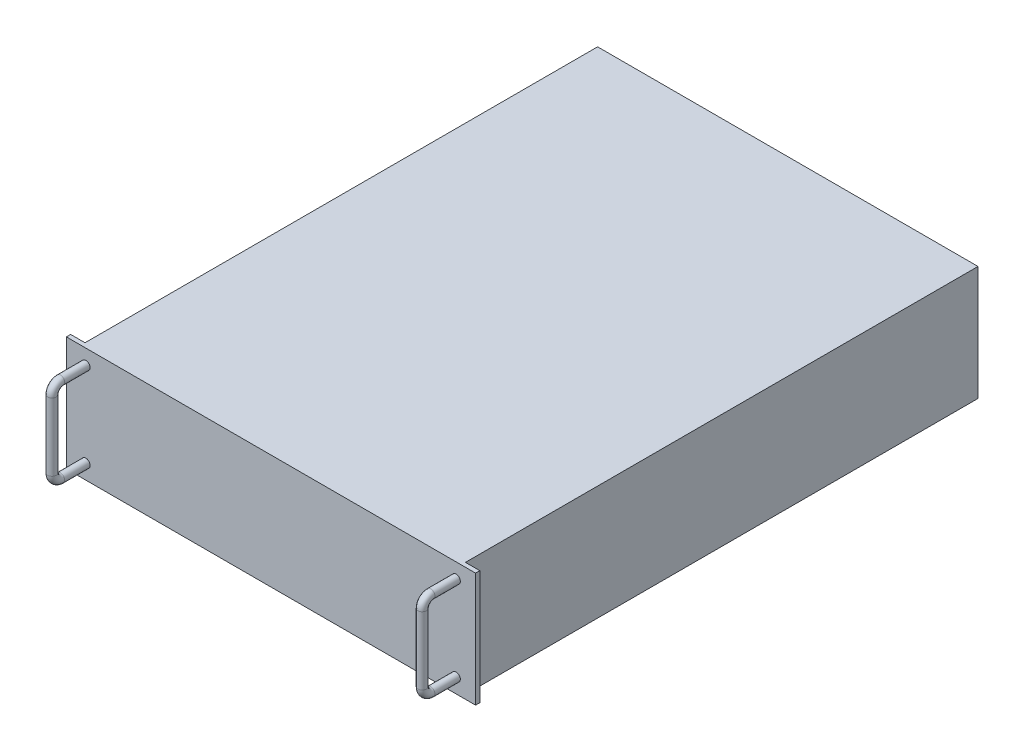
ISO-10303-21;
HEADER;
FILE_DESCRIPTION(('STEP AP214'),'2;1');
FILE_NAME('part.step','',(''),(''),'','','');
FILE_SCHEMA(('AUTOMOTIVE_DESIGN { 1 0 10303 214 1 1 1 1 }'));
ENDSEC;
DATA;
#1=APPLICATION_CONTEXT('core data for automotive mechanical design processes');
#2=APPLICATION_PROTOCOL_DEFINITION('international standard','automotive_design',2000,#1);
#3=PRODUCT_CONTEXT('',#1,'mechanical');
#4=PRODUCT('Part','Part','',(#3));
#5=PRODUCT_RELATED_PRODUCT_CATEGORY('part','',(#4));
#6=PRODUCT_DEFINITION_FORMATION('','',#4);
#7=PRODUCT_DEFINITION_CONTEXT('part definition',#1,'design');
#8=PRODUCT_DEFINITION('design','',#6,#7);
#9=PRODUCT_DEFINITION_SHAPE('','',#8);
#10=(LENGTH_UNIT() NAMED_UNIT(*) SI_UNIT(.MILLI.,.METRE.));
#11=(NAMED_UNIT(*) PLANE_ANGLE_UNIT() SI_UNIT($,.RADIAN.));
#12=(NAMED_UNIT(*) SI_UNIT($,.STERADIAN.) SOLID_ANGLE_UNIT());
#13=UNCERTAINTY_MEASURE_WITH_UNIT(LENGTH_MEASURE(1.E-05),#10,'distance_accuracy_value','');
#14=(GEOMETRIC_REPRESENTATION_CONTEXT(3) GLOBAL_UNCERTAINTY_ASSIGNED_CONTEXT((#13)) GLOBAL_UNIT_ASSIGNED_CONTEXT((#10,
#11,#12)) REPRESENTATION_CONTEXT('',''));
#15=CARTESIAN_POINT('',(0.,0.,0.));
#16=DIRECTION('',(0.,0.,1.));
#17=DIRECTION('',(1.,0.,0.));
#18=AXIS2_PLACEMENT_3D('',#15,#16,#17);
#19=CARTESIAN_POINT('',(0.,0.,0.));
#20=DIRECTION('',(0.,0.,-1.));
#21=DIRECTION('',(-1.,0.,0.));
#22=AXIS2_PLACEMENT_3D('',#19,#20,#21);
#23=PLANE('',#22);
#24=CARTESIAN_POINT('',(23.,117.5,0.));
#25=DIRECTION('',(0.,0.,-1.));
#26=DIRECTION('',(-1.,0.,0.));
#27=AXIS2_PLACEMENT_3D('',#24,#25,#26);
#28=CIRCLE('',#27,4.99999999999999);
#29=CARTESIAN_POINT('',(18.,117.5,0.));
#30=VERTEX_POINT('',#29);
#31=EDGE_CURVE('E196',#30,#30,#28,.F.);
#32=ORIENTED_EDGE('',*,*,#31,.F.);
#33=EDGE_LOOP('',(#32));
#34=FACE_BOUND('',#33,.T.);
#35=CARTESIAN_POINT('',(23.,17.5,0.));
#36=DIRECTION('',(0.,0.,1.));
#37=DIRECTION('',(-1.,0.,0.));
#38=AXIS2_PLACEMENT_3D('',#35,#36,#37);
#39=CIRCLE('',#38,4.99999999999999);
#40=CARTESIAN_POINT('',(18.,17.5,0.));
#41=VERTEX_POINT('',#40);
#42=EDGE_CURVE('E180',#41,#41,#39,.F.);
#43=ORIENTED_EDGE('',*,*,#42,.T.);
#44=EDGE_LOOP('',(#43));
#45=FACE_BOUND('',#44,.T.);
#46=CARTESIAN_POINT('',(460.,17.5,0.));
#47=DIRECTION('',(0.,0.,-1.));
#48=DIRECTION('',(1.,0.,0.));
#49=AXIS2_PLACEMENT_3D('',#46,#47,#48);
#50=CIRCLE('',#49,4.99999999999999);
#51=CARTESIAN_POINT('',(465.,17.5,0.));
#52=VERTEX_POINT('',#51);
#53=EDGE_CURVE('E152',#52,#52,#50,.T.);
#54=ORIENTED_EDGE('',*,*,#53,.T.);
#55=EDGE_LOOP('',(#54));
#56=FACE_BOUND('',#55,.T.);
#57=DIRECTION('',(0.,-1.,0.));
#58=VECTOR('',#57,1.);
#59=CARTESIAN_POINT('',(0.,0.,0.));
#60=LINE('',#59,#58);
#61=CARTESIAN_POINT('',(0.,135.,0.));
#62=VERTEX_POINT('',#61);
#63=CARTESIAN_POINT('',(0.,0.,0.));
#64=VERTEX_POINT('',#63);
#65=EDGE_CURVE('E137',#62,#64,#60,.T.);
#66=ORIENTED_EDGE('',*,*,#65,.T.);
#67=DIRECTION('',(1.,0.,0.));
#68=VECTOR('',#67,1.);
#69=CARTESIAN_POINT('',(0.,0.,0.));
#70=LINE('',#69,#68);
#71=CARTESIAN_POINT('',(483.,0.,0.));
#72=VERTEX_POINT('',#71);
#73=EDGE_CURVE('E135',#64,#72,#70,.T.);
#74=ORIENTED_EDGE('',*,*,#73,.T.);
#75=DIRECTION('',(0.,1.,0.));
#76=VECTOR('',#75,1.);
#77=CARTESIAN_POINT('',(483.,0.,0.));
#78=LINE('',#77,#76);
#79=CARTESIAN_POINT('',(483.,135.,0.));
#80=VERTEX_POINT('',#79);
#81=EDGE_CURVE('E123',#72,#80,#78,.T.);
#82=ORIENTED_EDGE('',*,*,#81,.T.);
#83=DIRECTION('',(-1.,0.,0.));
#84=VECTOR('',#83,1.);
#85=CARTESIAN_POINT('',(0.,135.,0.));
#86=LINE('',#85,#84);
#87=EDGE_CURVE('E130',#80,#62,#86,.T.);
#88=ORIENTED_EDGE('',*,*,#87,.T.);
#89=EDGE_LOOP('',(#66,#74,#82,#88));
#90=FACE_BOUND('',#89,.T.);
#91=CARTESIAN_POINT('',(460.,117.5,0.));
#92=DIRECTION('',(0.,0.,1.));
#93=DIRECTION('',(1.,0.,0.));
#94=AXIS2_PLACEMENT_3D('',#91,#92,#93);
#95=CIRCLE('',#94,4.99999999999999);
#96=CARTESIAN_POINT('',(465.,117.5,0.));
#97=VERTEX_POINT('',#96);
#98=EDGE_CURVE('E11',#97,#97,#95,.T.);
#99=ORIENTED_EDGE('',*,*,#98,.F.);
#100=EDGE_LOOP('',(#99));
#101=FACE_BOUND('',#100,.T.);
#102=ADVANCED_FACE('F34',(#34,#45,#56,#90,#101),#23,.F.);
#103=CARTESIAN_POINT('',(0.,0.,-610.));
#104=DIRECTION('',(-1.,0.,0.));
#105=DIRECTION('',(0.,0.,1.));
#106=AXIS2_PLACEMENT_3D('',#103,#104,#105);
#107=PLANE('',#106);
#108=DIRECTION('',(0.,0.,1.));
#109=VECTOR('',#108,1.);
#110=CARTESIAN_POINT('',(0.,135.,-610.));
#111=LINE('',#110,#109);
#112=CARTESIAN_POINT('',(0.,135.,-5.));
#113=VERTEX_POINT('',#112);
#114=EDGE_CURVE('E43',#113,#62,#111,.T.);
#115=ORIENTED_EDGE('',*,*,#114,.F.);
#116=DIRECTION('',(0.,1.,0.));
#117=VECTOR('',#116,1.);
#118=CARTESIAN_POINT('',(0.,0.,-5.));
#119=LINE('',#118,#117);
#120=CARTESIAN_POINT('',(0.,0.,-5.));
#121=VERTEX_POINT('',#120);
#122=EDGE_CURVE('E151',#121,#113,#119,.T.);
#123=ORIENTED_EDGE('',*,*,#122,.F.);
#124=DIRECTION('',(0.,0.,1.));
#125=VECTOR('',#124,1.);
#126=CARTESIAN_POINT('',(0.,0.,-610.));
#127=LINE('',#126,#125);
#128=EDGE_CURVE('E38',#121,#64,#127,.T.);
#129=ORIENTED_EDGE('',*,*,#128,.T.);
#130=ORIENTED_EDGE('',*,*,#65,.F.);
#131=EDGE_LOOP('',(#115,#123,#129,#130));
#132=FACE_BOUND('',#131,.T.);
#133=ADVANCED_FACE('F36',(#132),#107,.T.);
#134=CARTESIAN_POINT('',(483.,0.,-610.));
#135=DIRECTION('',(1.,0.,0.));
#136=DIRECTION('',(0.,0.,-1.));
#137=AXIS2_PLACEMENT_3D('',#134,#135,#136);
#138=PLANE('',#137);
#139=DIRECTION('',(0.,0.,1.));
#140=VECTOR('',#139,1.);
#141=CARTESIAN_POINT('',(483.,0.,-610.));
#142=LINE('',#141,#140);
#143=CARTESIAN_POINT('',(483.,0.,-5.));
#144=VERTEX_POINT('',#143);
#145=EDGE_CURVE('E116',#144,#72,#142,.T.);
#146=ORIENTED_EDGE('',*,*,#145,.F.);
#147=DIRECTION('',(0.,-1.,0.));
#148=VECTOR('',#147,1.);
#149=CARTESIAN_POINT('',(483.,135.,-5.));
#150=LINE('',#149,#148);
#151=CARTESIAN_POINT('',(483.,135.,-5.));
#152=VERTEX_POINT('',#151);
#153=EDGE_CURVE('E101',#152,#144,#150,.T.);
#154=ORIENTED_EDGE('',*,*,#153,.F.);
#155=DIRECTION('',(0.,0.,1.));
#156=VECTOR('',#155,1.);
#157=CARTESIAN_POINT('',(483.,135.,-610.));
#158=LINE('',#157,#156);
#159=EDGE_CURVE('E125',#152,#80,#158,.T.);
#160=ORIENTED_EDGE('',*,*,#159,.T.);
#161=ORIENTED_EDGE('',*,*,#81,.F.);
#162=EDGE_LOOP('',(#146,#154,#160,#161));
#163=FACE_BOUND('',#162,.T.);
#164=ADVANCED_FACE('F121',(#163),#138,.T.);
#165=CARTESIAN_POINT('',(0.,135.,-610.));
#166=DIRECTION('',(0.,1.,0.));
#167=DIRECTION('',(0.,0.,1.));
#168=AXIS2_PLACEMENT_3D('',#165,#166,#167);
#169=PLANE('',#168);
#170=DIRECTION('',(0.,0.,-1.));
#171=VECTOR('',#170,1.);
#172=CARTESIAN_POINT('',(466.,135.,-5.));
#173=LINE('',#172,#171);
#174=CARTESIAN_POINT('',(466.,135.,-5.));
#175=VERTEX_POINT('',#174);
#176=CARTESIAN_POINT('',(466.,135.,-610.));
#177=VERTEX_POINT('',#176);
#178=EDGE_CURVE('E140',#175,#177,#173,.T.);
#179=ORIENTED_EDGE('',*,*,#178,.T.);
#180=DIRECTION('',(-1.,0.,0.));
#181=VECTOR('',#180,1.);
#182=CARTESIAN_POINT('',(0.,135.,-610.));
#183=LINE('',#182,#181);
#184=CARTESIAN_POINT('',(17.,135.,-610.));
#185=VERTEX_POINT('',#184);
#186=EDGE_CURVE('E127',#177,#185,#183,.T.);
#187=ORIENTED_EDGE('',*,*,#186,.T.);
#188=DIRECTION('',(0.,0.,-1.));
#189=VECTOR('',#188,1.);
#190=CARTESIAN_POINT('',(17.,135.,-5.));
#191=LINE('',#190,#189);
#192=CARTESIAN_POINT('',(17.,135.,-5.));
#193=VERTEX_POINT('',#192);
#194=EDGE_CURVE('E59',#193,#185,#191,.T.);
#195=ORIENTED_EDGE('',*,*,#194,.F.);
#196=DIRECTION('',(1.,0.,0.));
#197=VECTOR('',#196,1.);
#198=CARTESIAN_POINT('',(0.,135.,-5.));
#199=LINE('',#198,#197);
#200=EDGE_CURVE('E157',#113,#193,#199,.T.);
#201=ORIENTED_EDGE('',*,*,#200,.F.);
#202=ORIENTED_EDGE('',*,*,#114,.T.);
#203=ORIENTED_EDGE('',*,*,#87,.F.);
#204=ORIENTED_EDGE('',*,*,#159,.F.);
#205=DIRECTION('',(1.,0.,0.));
#206=VECTOR('',#205,1.);
#207=CARTESIAN_POINT('',(483.,135.,-5.));
#208=LINE('',#207,#206);
#209=EDGE_CURVE('E107',#175,#152,#208,.T.);
#210=ORIENTED_EDGE('',*,*,#209,.F.);
#211=EDGE_LOOP('',(#179,#187,#195,#201,#202,#203,#204,#210));
#212=FACE_BOUND('',#211,.T.);
#213=ADVANCED_FACE('F280',(#212),#169,.T.);
#214=CARTESIAN_POINT('',(0.,0.,-610.));
#215=DIRECTION('',(0.,-1.,0.));
#216=DIRECTION('',(0.,0.,-1.));
#217=AXIS2_PLACEMENT_3D('',#214,#215,#216);
#218=PLANE('',#217);
#219=DIRECTION('',(0.,0.,-1.));
#220=VECTOR('',#219,1.);
#221=CARTESIAN_POINT('',(466.,0.,-5.));
#222=LINE('',#221,#220);
#223=CARTESIAN_POINT('',(466.,0.,-5.));
#224=VERTEX_POINT('',#223);
#225=CARTESIAN_POINT('',(466.,0.,-610.));
#226=VERTEX_POINT('',#225);
#227=EDGE_CURVE('E51',#224,#226,#222,.T.);
#228=ORIENTED_EDGE('',*,*,#227,.F.);
#229=DIRECTION('',(-1.,0.,0.));
#230=VECTOR('',#229,1.);
#231=CARTESIAN_POINT('',(483.,0.,-5.));
#232=LINE('',#231,#230);
#233=EDGE_CURVE('E105',#144,#224,#232,.T.);
#234=ORIENTED_EDGE('',*,*,#233,.F.);
#235=ORIENTED_EDGE('',*,*,#145,.T.);
#236=ORIENTED_EDGE('',*,*,#73,.F.);
#237=ORIENTED_EDGE('',*,*,#128,.F.);
#238=DIRECTION('',(-1.,0.,0.));
#239=VECTOR('',#238,1.);
#240=CARTESIAN_POINT('',(0.,0.,-5.));
#241=LINE('',#240,#239);
#242=CARTESIAN_POINT('',(17.,0.,-5.));
#243=VERTEX_POINT('',#242);
#244=EDGE_CURVE('E146',#243,#121,#241,.T.);
#245=ORIENTED_EDGE('',*,*,#244,.F.);
#246=DIRECTION('',(0.,0.,-1.));
#247=VECTOR('',#246,1.);
#248=CARTESIAN_POINT('',(17.,0.,-5.));
#249=LINE('',#248,#247);
#250=CARTESIAN_POINT('',(17.,0.,-610.));
#251=VERTEX_POINT('',#250);
#252=EDGE_CURVE('E145',#243,#251,#249,.T.);
#253=ORIENTED_EDGE('',*,*,#252,.T.);
#254=DIRECTION('',(1.,0.,0.));
#255=VECTOR('',#254,1.);
#256=CARTESIAN_POINT('',(0.,0.,-610.));
#257=LINE('',#256,#255);
#258=EDGE_CURVE('E133',#251,#226,#257,.T.);
#259=ORIENTED_EDGE('',*,*,#258,.T.);
#260=EDGE_LOOP('',(#228,#234,#235,#236,#237,#245,#253,#259));
#261=FACE_BOUND('',#260,.T.);
#262=ADVANCED_FACE('F114',(#261),#218,.T.);
#263=CARTESIAN_POINT('',(0.,0.,-610.));
#264=DIRECTION('',(0.,0.,-1.));
#265=DIRECTION('',(-1.,0.,0.));
#266=AXIS2_PLACEMENT_3D('',#263,#264,#265);
#267=PLANE('',#266);
#268=DIRECTION('',(0.,1.,0.));
#269=VECTOR('',#268,1.);
#270=CARTESIAN_POINT('',(466.,135.,-610.));
#271=LINE('',#270,#269);
#272=EDGE_CURVE('E111',#226,#177,#271,.T.);
#273=ORIENTED_EDGE('',*,*,#272,.F.);
#274=ORIENTED_EDGE('',*,*,#258,.F.);
#275=DIRECTION('',(0.,-1.,0.));
#276=VECTOR('',#275,1.);
#277=CARTESIAN_POINT('',(17.,0.,-610.));
#278=LINE('',#277,#276);
#279=EDGE_CURVE('E149',#185,#251,#278,.T.);
#280=ORIENTED_EDGE('',*,*,#279,.F.);
#281=ORIENTED_EDGE('',*,*,#186,.F.);
#282=EDGE_LOOP('',(#273,#274,#280,#281));
#283=FACE_BOUND('',#282,.T.);
#284=ADVANCED_FACE('F276',(#283),#267,.T.);
#285=CARTESIAN_POINT('',(17.,0.,-5.));
#286=DIRECTION('',(1.,0.,0.));
#287=DIRECTION('',(0.,0.,-1.));
#288=AXIS2_PLACEMENT_3D('',#285,#286,#287);
#289=PLANE('',#288);
#290=ORIENTED_EDGE('',*,*,#279,.T.);
#291=ORIENTED_EDGE('',*,*,#252,.F.);
#292=DIRECTION('',(0.,-1.,0.));
#293=VECTOR('',#292,1.);
#294=CARTESIAN_POINT('',(17.,0.,-5.));
#295=LINE('',#294,#293);
#296=EDGE_CURVE('E154',#193,#243,#295,.T.);
#297=ORIENTED_EDGE('',*,*,#296,.F.);
#298=ORIENTED_EDGE('',*,*,#194,.T.);
#299=EDGE_LOOP('',(#290,#291,#297,#298));
#300=FACE_BOUND('',#299,.T.);
#301=ADVANCED_FACE('F272',(#300),#289,.F.);
#302=CARTESIAN_POINT('',(0.,0.,-5.));
#303=DIRECTION('',(0.,0.,-1.));
#304=DIRECTION('',(-1.,0.,0.));
#305=AXIS2_PLACEMENT_3D('',#302,#303,#304);
#306=PLANE('',#305);
#307=ORIENTED_EDGE('',*,*,#122,.T.);
#308=ORIENTED_EDGE('',*,*,#200,.T.);
#309=ORIENTED_EDGE('',*,*,#296,.T.);
#310=ORIENTED_EDGE('',*,*,#244,.T.);
#311=EDGE_LOOP('',(#307,#308,#309,#310));
#312=FACE_BOUND('',#311,.T.);
#313=ADVANCED_FACE('F269',(#312),#306,.T.);
#314=CARTESIAN_POINT('',(466.,135.,-5.));
#315=DIRECTION('',(-1.,0.,0.));
#316=DIRECTION('',(0.,0.,1.));
#317=AXIS2_PLACEMENT_3D('',#314,#315,#316);
#318=PLANE('',#317);
#319=ORIENTED_EDGE('',*,*,#272,.T.);
#320=ORIENTED_EDGE('',*,*,#178,.F.);
#321=DIRECTION('',(0.,1.,0.));
#322=VECTOR('',#321,1.);
#323=CARTESIAN_POINT('',(466.,135.,-5.));
#324=LINE('',#323,#322);
#325=EDGE_CURVE('E119',#224,#175,#324,.T.);
#326=ORIENTED_EDGE('',*,*,#325,.F.);
#327=ORIENTED_EDGE('',*,*,#227,.T.);
#328=EDGE_LOOP('',(#319,#320,#326,#327));
#329=FACE_BOUND('',#328,.T.);
#330=ADVANCED_FACE('F226',(#329),#318,.F.);
#331=CARTESIAN_POINT('',(0.,0.,-5.));
#332=DIRECTION('',(0.,0.,-1.));
#333=DIRECTION('',(-1.,0.,0.));
#334=AXIS2_PLACEMENT_3D('',#331,#332,#333);
#335=PLANE('',#334);
#336=ORIENTED_EDGE('',*,*,#153,.T.);
#337=ORIENTED_EDGE('',*,*,#233,.T.);
#338=ORIENTED_EDGE('',*,*,#325,.T.);
#339=ORIENTED_EDGE('',*,*,#209,.T.);
#340=EDGE_LOOP('',(#336,#337,#338,#339));
#341=FACE_BOUND('',#340,.T.);
#342=ADVANCED_FACE('F103',(#341),#335,.T.);
#343=CARTESIAN_POINT('',(460.,117.5,0.));
#344=DIRECTION('',(0.,0.,1.));
#345=DIRECTION('',(0.,-1.,0.));
#346=AXIS2_PLACEMENT_3D('',#343,#344,#345);
#347=CYLINDRICAL_SURFACE('',#346,4.99999999999999);
#348=CARTESIAN_POINT('',(460.,117.5,29.9999999999999));
#349=DIRECTION('',(0.,0.,1.));
#350=DIRECTION('',(1.,0.,0.));
#351=AXIS2_PLACEMENT_3D('',#348,#349,#350);
#352=CIRCLE('',#351,4.99999999999999);
#353=CARTESIAN_POINT('',(460.,122.5,29.9999999999999));
#354=VERTEX_POINT('',#353);
#355=EDGE_CURVE('E178',#354,#354,#352,.T.);
#356=ORIENTED_EDGE('',*,*,#355,.F.);
#357=EDGE_LOOP('',(#356));
#358=FACE_BOUND('',#357,.T.);
#359=ORIENTED_EDGE('',*,*,#98,.T.);
#360=EDGE_LOOP('',(#359));
#361=FACE_BOUND('',#360,.T.);
#362=ADVANCED_FACE('F213',(#358,#361),#347,.T.);
#363=CARTESIAN_POINT('',(460.,107.5,30.));
#364=DIRECTION('',(1.,0.,0.));
#365=DIRECTION('',(0.,0.,-1.));
#366=AXIS2_PLACEMENT_3D('',#363,#364,#365);
#367=TOROIDAL_SURFACE('',#366,9.99999999999998,4.99999999999999);
#368=CARTESIAN_POINT('',(460.,107.5,40.));
#369=DIRECTION('',(0.,-1.,0.));
#370=DIRECTION('',(1.,0.,0.));
#371=AXIS2_PLACEMENT_3D('',#368,#369,#370);
#372=CIRCLE('',#371,4.99999999999999);
#373=CARTESIAN_POINT('',(460.,107.5,45.));
#374=VERTEX_POINT('',#373);
#375=EDGE_CURVE('E175',#374,#374,#372,.T.);
#376=CARTESIAN_POINT('',(460.,107.5,30.));
#377=DIRECTION('',(1.,0.,0.));
#378=DIRECTION('',(0.,0.,-1.));
#379=AXIS2_PLACEMENT_3D('',#376,#377,#378);
#380=CIRCLE('',#379,15.);
#381=EDGE_CURVE('',#354,#374,#380,.T.);
#382=ORIENTED_EDGE('',*,*,#355,.T.);
#383=ORIENTED_EDGE('',*,*,#375,.F.);
#384=ORIENTED_EDGE('',*,*,#381,.T.);
#385=ORIENTED_EDGE('',*,*,#381,.F.);
#386=EDGE_LOOP('',(#382,#384,#383,#385));
#387=FACE_BOUND('',#386,.T.);
#388=ADVANCED_FACE('F215',(#387),#367,.T.);
#389=CARTESIAN_POINT('',(460.,107.5,40.));
#390=DIRECTION('',(0.,-1.,0.));
#391=DIRECTION('',(0.,0.,-1.));
#392=AXIS2_PLACEMENT_3D('',#389,#390,#391);
#393=CYLINDRICAL_SURFACE('',#392,4.99999999999999);
#394=CARTESIAN_POINT('',(460.,27.5000000000001,40.));
#395=DIRECTION('',(0.,-1.,0.));
#396=DIRECTION('',(1.,0.,0.));
#397=AXIS2_PLACEMENT_3D('',#394,#395,#396);
#398=CIRCLE('',#397,4.99999999999999);
#399=CARTESIAN_POINT('',(460.,27.5000000000001,45.));
#400=VERTEX_POINT('',#399);
#401=EDGE_CURVE('E172',#400,#400,#398,.T.);
#402=ORIENTED_EDGE('',*,*,#401,.F.);
#403=EDGE_LOOP('',(#402));
#404=FACE_BOUND('',#403,.T.);
#405=ORIENTED_EDGE('',*,*,#375,.T.);
#406=EDGE_LOOP('',(#405));
#407=FACE_BOUND('',#406,.T.);
#408=ADVANCED_FACE('F223',(#404,#407),#393,.T.);
#409=CARTESIAN_POINT('',(460.,27.5,30.));
#410=DIRECTION('',(1.,0.,0.));
#411=DIRECTION('',(0.,0.,-1.));
#412=AXIS2_PLACEMENT_3D('',#409,#410,#411);
#413=TOROIDAL_SURFACE('',#412,9.99999999999999,4.99999999999999);
#414=CARTESIAN_POINT('',(460.,17.5,29.9999999999999));
#415=DIRECTION('',(0.,0.,-1.));
#416=DIRECTION('',(1.,0.,0.));
#417=AXIS2_PLACEMENT_3D('',#414,#415,#416);
#418=CIRCLE('',#417,4.99999999999999);
#419=CARTESIAN_POINT('',(460.,12.5,29.9999999999999));
#420=VERTEX_POINT('',#419);
#421=EDGE_CURVE('E169',#420,#420,#418,.T.);
#422=CARTESIAN_POINT('',(460.,27.5,30.));
#423=DIRECTION('',(1.,0.,0.));
#424=DIRECTION('',(0.,0.,-1.));
#425=AXIS2_PLACEMENT_3D('',#422,#423,#424);
#426=CIRCLE('',#425,15.);
#427=EDGE_CURVE('',#400,#420,#426,.T.);
#428=ORIENTED_EDGE('',*,*,#401,.T.);
#429=ORIENTED_EDGE('',*,*,#421,.F.);
#430=ORIENTED_EDGE('',*,*,#427,.T.);
#431=ORIENTED_EDGE('',*,*,#427,.F.);
#432=EDGE_LOOP('',(#428,#430,#429,#431));
#433=FACE_BOUND('',#432,.T.);
#434=ADVANCED_FACE('F254',(#433),#413,.T.);
#435=CARTESIAN_POINT('',(460.,17.5,29.9999999999999));
#436=DIRECTION('',(0.,0.,-1.));
#437=DIRECTION('',(-1.,0.,0.));
#438=AXIS2_PLACEMENT_3D('',#435,#436,#437);
#439=CYLINDRICAL_SURFACE('',#438,4.99999999999999);
#440=ORIENTED_EDGE('',*,*,#53,.F.);
#441=EDGE_LOOP('',(#440));
#442=FACE_BOUND('',#441,.T.);
#443=ORIENTED_EDGE('',*,*,#421,.T.);
#444=EDGE_LOOP('',(#443));
#445=FACE_BOUND('',#444,.T.);
#446=ADVANCED_FACE('F228',(#442,#445),#439,.T.);
#447=CARTESIAN_POINT('',(23.,117.5,0.));
#448=DIRECTION('',(0.,0.,1.));
#449=DIRECTION('',(0.,-1.,0.));
#450=AXIS2_PLACEMENT_3D('',#447,#448,#449);
#451=CYLINDRICAL_SURFACE('',#450,4.99999999999999);
#452=CARTESIAN_POINT('',(23.,117.5,29.9999999999999));
#453=DIRECTION('',(0.,0.,-1.));
#454=DIRECTION('',(-1.,0.,0.));
#455=AXIS2_PLACEMENT_3D('',#452,#453,#454);
#456=CIRCLE('',#455,4.99999999999999);
#457=CARTESIAN_POINT('',(23.,122.5,29.9999999999999));
#458=VERTEX_POINT('',#457);
#459=EDGE_CURVE('E193',#458,#458,#456,.F.);
#460=ORIENTED_EDGE('',*,*,#459,.F.);
#461=EDGE_LOOP('',(#460));
#462=FACE_BOUND('',#461,.T.);
#463=ORIENTED_EDGE('',*,*,#31,.T.);
#464=EDGE_LOOP('',(#463));
#465=FACE_BOUND('',#464,.T.);
#466=ADVANCED_FACE('F200',(#462,#465),#451,.T.);
#467=CARTESIAN_POINT('',(23.,107.5,30.));
#468=DIRECTION('',(1.,0.,0.));
#469=DIRECTION('',(0.,0.,-1.));
#470=AXIS2_PLACEMENT_3D('',#467,#468,#469);
#471=TOROIDAL_SURFACE('',#470,9.99999999999998,4.99999999999999);
#472=CARTESIAN_POINT('',(23.,107.5,40.));
#473=DIRECTION('',(0.,1.,0.));
#474=DIRECTION('',(-1.,0.,0.));
#475=AXIS2_PLACEMENT_3D('',#472,#473,#474);
#476=CIRCLE('',#475,4.99999999999999);
#477=CARTESIAN_POINT('',(23.,107.5,45.));
#478=VERTEX_POINT('',#477);
#479=EDGE_CURVE('E190',#478,#478,#476,.F.);
#480=CARTESIAN_POINT('',(23.,107.5,30.));
#481=DIRECTION('',(1.,0.,0.));
#482=DIRECTION('',(0.,0.,-1.));
#483=AXIS2_PLACEMENT_3D('',#480,#481,#482);
#484=CIRCLE('',#483,15.);
#485=EDGE_CURVE('',#458,#478,#484,.T.);
#486=ORIENTED_EDGE('',*,*,#459,.T.);
#487=ORIENTED_EDGE('',*,*,#479,.F.);
#488=ORIENTED_EDGE('',*,*,#485,.T.);
#489=ORIENTED_EDGE('',*,*,#485,.F.);
#490=EDGE_LOOP('',(#486,#488,#487,#489));
#491=FACE_BOUND('',#490,.T.);
#492=ADVANCED_FACE('F244',(#491),#471,.T.);
#493=CARTESIAN_POINT('',(23.,107.5,40.));
#494=DIRECTION('',(0.,-1.,0.));
#495=DIRECTION('',(0.,0.,-1.));
#496=AXIS2_PLACEMENT_3D('',#493,#494,#495);
#497=CYLINDRICAL_SURFACE('',#496,4.99999999999999);
#498=CARTESIAN_POINT('',(23.,27.5000000000001,40.));
#499=DIRECTION('',(0.,1.,0.));
#500=DIRECTION('',(-1.,0.,0.));
#501=AXIS2_PLACEMENT_3D('',#498,#499,#500);
#502=CIRCLE('',#501,4.99999999999999);
#503=CARTESIAN_POINT('',(23.,27.5000000000001,45.));
#504=VERTEX_POINT('',#503);
#505=EDGE_CURVE('E187',#504,#504,#502,.F.);
#506=ORIENTED_EDGE('',*,*,#505,.F.);
#507=EDGE_LOOP('',(#506));
#508=FACE_BOUND('',#507,.T.);
#509=ORIENTED_EDGE('',*,*,#479,.T.);
#510=EDGE_LOOP('',(#509));
#511=FACE_BOUND('',#510,.T.);
#512=ADVANCED_FACE('F237',(#508,#511),#497,.T.);
#513=CARTESIAN_POINT('',(23.,27.5,30.));
#514=DIRECTION('',(1.,0.,0.));
#515=DIRECTION('',(0.,0.,-1.));
#516=AXIS2_PLACEMENT_3D('',#513,#514,#515);
#517=TOROIDAL_SURFACE('',#516,9.99999999999999,4.99999999999999);
#518=CARTESIAN_POINT('',(23.,17.5,29.9999999999999));
#519=DIRECTION('',(0.,0.,1.));
#520=DIRECTION('',(-1.,0.,0.));
#521=AXIS2_PLACEMENT_3D('',#518,#519,#520);
#522=CIRCLE('',#521,4.99999999999999);
#523=CARTESIAN_POINT('',(23.,12.5,29.9999999999999));
#524=VERTEX_POINT('',#523);
#525=EDGE_CURVE('E184',#524,#524,#522,.F.);
#526=CARTESIAN_POINT('',(23.,27.5,30.));
#527=DIRECTION('',(1.,0.,0.));
#528=DIRECTION('',(0.,0.,-1.));
#529=AXIS2_PLACEMENT_3D('',#526,#527,#528);
#530=CIRCLE('',#529,15.);
#531=EDGE_CURVE('',#504,#524,#530,.T.);
#532=ORIENTED_EDGE('',*,*,#505,.T.);
#533=ORIENTED_EDGE('',*,*,#525,.F.);
#534=ORIENTED_EDGE('',*,*,#531,.T.);
#535=ORIENTED_EDGE('',*,*,#531,.F.);
#536=EDGE_LOOP('',(#532,#534,#533,#535));
#537=FACE_BOUND('',#536,.T.);
#538=ADVANCED_FACE('F232',(#537),#517,.T.);
#539=CARTESIAN_POINT('',(23.,17.5,29.9999999999999));
#540=DIRECTION('',(0.,0.,-1.));
#541=DIRECTION('',(-1.,0.,0.));
#542=AXIS2_PLACEMENT_3D('',#539,#540,#541);
#543=CYLINDRICAL_SURFACE('',#542,4.99999999999999);
#544=ORIENTED_EDGE('',*,*,#42,.F.);
#545=EDGE_LOOP('',(#544));
#546=FACE_BOUND('',#545,.T.);
#547=ORIENTED_EDGE('',*,*,#525,.T.);
#548=EDGE_LOOP('',(#547));
#549=FACE_BOUND('',#548,.T.);
#550=ADVANCED_FACE('F218',(#546,#549),#543,.T.);
#551=CLOSED_SHELL('',(#102,#133,#164,#213,#262,#284,#301,#313,#330,#342,#362,#388,#408,#434,
#446,#466,#492,#512,#538,#550));
#552=MANIFOLD_SOLID_BREP('B2',#551);
#553=ADVANCED_BREP_SHAPE_REPRESENTATION('',(#18,#552),#14);
#554=SHAPE_DEFINITION_REPRESENTATION(#9,#553);
ENDSEC;
END-ISO-10303-21;
